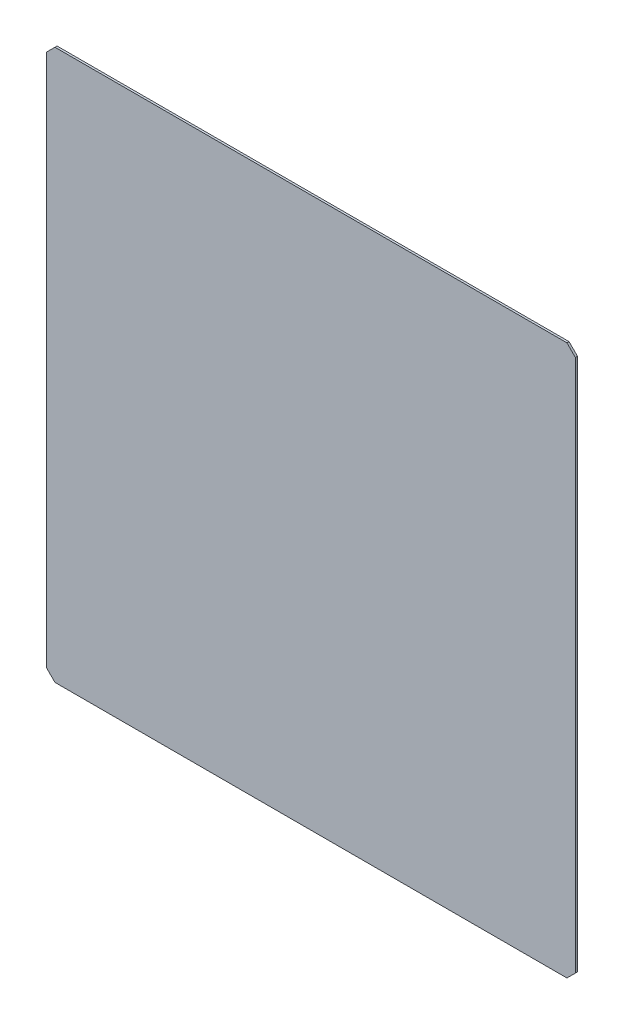
ISO-10303-21;
HEADER;
FILE_DESCRIPTION(('STEP AP214'),'2;1');
FILE_NAME('part.step','',(''),(''),'','','');
FILE_SCHEMA(('AUTOMOTIVE_DESIGN { 1 0 10303 214 1 1 1 1 }'));
ENDSEC;
DATA;
#1=APPLICATION_CONTEXT('core data for automotive mechanical design processes');
#2=APPLICATION_PROTOCOL_DEFINITION('international standard','automotive_design',2000,#1);
#3=PRODUCT_CONTEXT('',#1,'mechanical');
#4=PRODUCT('Part','Part','',(#3));
#5=PRODUCT_RELATED_PRODUCT_CATEGORY('part','',(#4));
#6=PRODUCT_DEFINITION_FORMATION('','',#4);
#7=PRODUCT_DEFINITION_CONTEXT('part definition',#1,'design');
#8=PRODUCT_DEFINITION('design','',#6,#7);
#9=PRODUCT_DEFINITION_SHAPE('','',#8);
#10=(LENGTH_UNIT() NAMED_UNIT(*) SI_UNIT(.MILLI.,.METRE.));
#11=(NAMED_UNIT(*) PLANE_ANGLE_UNIT() SI_UNIT($,.RADIAN.));
#12=(NAMED_UNIT(*) SI_UNIT($,.STERADIAN.) SOLID_ANGLE_UNIT());
#13=UNCERTAINTY_MEASURE_WITH_UNIT(LENGTH_MEASURE(1.E-05),#10,'distance_accuracy_value','');
#14=(GEOMETRIC_REPRESENTATION_CONTEXT(3) GLOBAL_UNCERTAINTY_ASSIGNED_CONTEXT((#13)) GLOBAL_UNIT_ASSIGNED_CONTEXT((#10,
#11,#12)) REPRESENTATION_CONTEXT('',''));
#15=CARTESIAN_POINT('',(0.,0.,0.));
#16=DIRECTION('',(0.,0.,1.));
#17=DIRECTION('',(1.,0.,0.));
#18=AXIS2_PLACEMENT_3D('',#15,#16,#17);
#19=CARTESIAN_POINT('',(-6.25,6.5,0.05));
#20=DIRECTION('',(1.,0.,0.));
#21=DIRECTION('',(0.,0.,-1.));
#22=AXIS2_PLACEMENT_3D('',#19,#20,#21);
#23=PLANE('',#22);
#24=DIRECTION('',(0.,-1.,0.));
#25=VECTOR('',#24,1.);
#26=CARTESIAN_POINT('',(-6.25,6.5,0.05));
#27=LINE('',#26,#25);
#28=CARTESIAN_POINT('',(-6.25,6.3,0.05));
#29=VERTEX_POINT('',#28);
#30=CARTESIAN_POINT('',(-6.25,-6.3,0.05));
#31=VERTEX_POINT('',#30);
#32=EDGE_CURVE('E11',#29,#31,#27,.T.);
#33=ORIENTED_EDGE('',*,*,#32,.F.);
#34=DIRECTION('',(0.,0.,-1.));
#35=VECTOR('',#34,1.);
#36=CARTESIAN_POINT('',(-6.25,6.3,0.05));
#37=LINE('',#36,#35);
#38=CARTESIAN_POINT('',(-6.25,6.3,0.));
#39=VERTEX_POINT('',#38);
#40=EDGE_CURVE('E23',#29,#39,#37,.T.);
#41=ORIENTED_EDGE('',*,*,#40,.T.);
#42=DIRECTION('',(0.,-1.,0.));
#43=VECTOR('',#42,1.);
#44=CARTESIAN_POINT('',(-6.25,6.5,0.));
#45=LINE('',#44,#43);
#46=CARTESIAN_POINT('',(-6.25,-6.3,0.));
#47=VERTEX_POINT('',#46);
#48=EDGE_CURVE('E143',#39,#47,#45,.T.);
#49=ORIENTED_EDGE('',*,*,#48,.T.);
#50=DIRECTION('',(0.,0.,1.));
#51=VECTOR('',#50,1.);
#52=CARTESIAN_POINT('',(-6.25,-6.3,0.05));
#53=LINE('',#52,#51);
#54=EDGE_CURVE('E36',#47,#31,#53,.T.);
#55=ORIENTED_EDGE('',*,*,#54,.T.);
#56=EDGE_LOOP('',(#33,#41,#49,#55));
#57=FACE_BOUND('',#56,.T.);
#58=ADVANCED_FACE('F16',(#57),#23,.F.);
#59=CARTESIAN_POINT('',(-6.05,-6.5,0.05));
#60=DIRECTION('',(0.707106781186548,0.707106781186548,0.));
#61=DIRECTION('',(-0.707106781186548,0.707106781186548,0.));
#62=AXIS2_PLACEMENT_3D('',#59,#60,#61);
#63=PLANE('',#62);
#64=DIRECTION('',(-0.707106781186548,0.707106781186548,0.));
#65=VECTOR('',#64,1.);
#66=CARTESIAN_POINT('',(-6.15,-6.4,0.05));
#67=LINE('',#66,#65);
#68=CARTESIAN_POINT('',(-6.05,-6.5,0.05));
#69=VERTEX_POINT('',#68);
#70=EDGE_CURVE('E88',#69,#31,#67,.T.);
#71=ORIENTED_EDGE('',*,*,#70,.T.);
#72=ORIENTED_EDGE('',*,*,#54,.F.);
#73=DIRECTION('',(0.707106781186548,-0.707106781186548,0.));
#74=VECTOR('',#73,1.);
#75=CARTESIAN_POINT('',(-6.05,-6.5,0.));
#76=LINE('',#75,#74);
#77=CARTESIAN_POINT('',(-6.05,-6.5,0.));
#78=VERTEX_POINT('',#77);
#79=EDGE_CURVE('E138',#47,#78,#76,.T.);
#80=ORIENTED_EDGE('',*,*,#79,.T.);
#81=DIRECTION('',(0.,0.,-1.));
#82=VECTOR('',#81,1.);
#83=CARTESIAN_POINT('',(-6.05,-6.5,0.05));
#84=LINE('',#83,#82);
#85=EDGE_CURVE('E136',#69,#78,#84,.T.);
#86=ORIENTED_EDGE('',*,*,#85,.F.);
#87=EDGE_LOOP('',(#71,#72,#80,#86));
#88=FACE_BOUND('',#87,.T.);
#89=ADVANCED_FACE('F152',(#88),#63,.F.);
#90=CARTESIAN_POINT('',(6.05,6.5,0.05));
#91=DIRECTION('',(-0.707106781186548,-0.707106781186548,0.));
#92=DIRECTION('',(0.707106781186548,-0.707106781186548,0.));
#93=AXIS2_PLACEMENT_3D('',#90,#91,#92);
#94=PLANE('',#93);
#95=DIRECTION('',(0.707106781186548,-0.707106781186548,0.));
#96=VECTOR('',#95,1.);
#97=CARTESIAN_POINT('',(6.4,6.15,0.05));
#98=LINE('',#97,#96);
#99=CARTESIAN_POINT('',(6.05,6.5,0.05));
#100=VERTEX_POINT('',#99);
#101=CARTESIAN_POINT('',(6.25,6.3,0.05));
#102=VERTEX_POINT('',#101);
#103=EDGE_CURVE('E133',#100,#102,#98,.T.);
#104=ORIENTED_EDGE('',*,*,#103,.T.);
#105=DIRECTION('',(0.,0.,1.));
#106=VECTOR('',#105,1.);
#107=CARTESIAN_POINT('',(6.25,6.3,0.05));
#108=LINE('',#107,#106);
#109=CARTESIAN_POINT('',(6.25,6.3,0.));
#110=VERTEX_POINT('',#109);
#111=EDGE_CURVE('E131',#110,#102,#108,.T.);
#112=ORIENTED_EDGE('',*,*,#111,.F.);
#113=DIRECTION('',(-0.707106781186548,0.707106781186548,0.));
#114=VECTOR('',#113,1.);
#115=CARTESIAN_POINT('',(6.05,6.5,0.));
#116=LINE('',#115,#114);
#117=CARTESIAN_POINT('',(6.05,6.5,0.));
#118=VERTEX_POINT('',#117);
#119=EDGE_CURVE('E128',#110,#118,#116,.T.);
#120=ORIENTED_EDGE('',*,*,#119,.T.);
#121=DIRECTION('',(0.,0.,-1.));
#122=VECTOR('',#121,1.);
#123=CARTESIAN_POINT('',(6.05,6.5,0.05));
#124=LINE('',#123,#122);
#125=EDGE_CURVE('E126',#100,#118,#124,.T.);
#126=ORIENTED_EDGE('',*,*,#125,.F.);
#127=EDGE_LOOP('',(#104,#112,#120,#126));
#128=FACE_BOUND('',#127,.T.);
#129=ADVANCED_FACE('F154',(#128),#94,.F.);
#130=CARTESIAN_POINT('',(6.25,6.5,0.05));
#131=DIRECTION('',(0.,-1.,0.));
#132=DIRECTION('',(0.,0.,-1.));
#133=AXIS2_PLACEMENT_3D('',#130,#131,#132);
#134=PLANE('',#133);
#135=DIRECTION('',(-1.,0.,0.));
#136=VECTOR('',#135,1.);
#137=CARTESIAN_POINT('',(6.25,6.5,0.05));
#138=LINE('',#137,#136);
#139=CARTESIAN_POINT('',(-6.05,6.5,0.05));
#140=VERTEX_POINT('',#139);
#141=EDGE_CURVE('E123',#100,#140,#138,.T.);
#142=ORIENTED_EDGE('',*,*,#141,.F.);
#143=ORIENTED_EDGE('',*,*,#125,.T.);
#144=DIRECTION('',(-1.,0.,0.));
#145=VECTOR('',#144,1.);
#146=CARTESIAN_POINT('',(6.25,6.5,0.));
#147=LINE('',#146,#145);
#148=CARTESIAN_POINT('',(-6.05,6.5,0.));
#149=VERTEX_POINT('',#148);
#150=EDGE_CURVE('E120',#118,#149,#147,.T.);
#151=ORIENTED_EDGE('',*,*,#150,.T.);
#152=DIRECTION('',(0.,0.,1.));
#153=VECTOR('',#152,1.);
#154=CARTESIAN_POINT('',(-6.05,6.5,0.05));
#155=LINE('',#154,#153);
#156=EDGE_CURVE('E118',#149,#140,#155,.T.);
#157=ORIENTED_EDGE('',*,*,#156,.T.);
#158=EDGE_LOOP('',(#142,#143,#151,#157));
#159=FACE_BOUND('',#158,.T.);
#160=ADVANCED_FACE('F160',(#159),#134,.F.);
#161=CARTESIAN_POINT('',(-6.25,-6.5,0.));
#162=DIRECTION('',(0.,0.,1.));
#163=DIRECTION('',(1.,0.,0.));
#164=AXIS2_PLACEMENT_3D('',#161,#162,#163);
#165=PLANE('',#164);
#166=ORIENTED_EDGE('',*,*,#150,.F.);
#167=ORIENTED_EDGE('',*,*,#119,.F.);
#168=DIRECTION('',(0.,1.,0.));
#169=VECTOR('',#168,1.);
#170=CARTESIAN_POINT('',(6.25,-6.5,0.));
#171=LINE('',#170,#169);
#172=CARTESIAN_POINT('',(6.25,-6.3,0.));
#173=VERTEX_POINT('',#172);
#174=EDGE_CURVE('E115',#173,#110,#171,.T.);
#175=ORIENTED_EDGE('',*,*,#174,.F.);
#176=DIRECTION('',(0.707106781186548,0.707106781186548,0.));
#177=VECTOR('',#176,1.);
#178=CARTESIAN_POINT('',(6.25,-6.3,0.));
#179=LINE('',#178,#177);
#180=CARTESIAN_POINT('',(6.05,-6.5,0.));
#181=VERTEX_POINT('',#180);
#182=EDGE_CURVE('E113',#181,#173,#179,.T.);
#183=ORIENTED_EDGE('',*,*,#182,.F.);
#184=DIRECTION('',(1.,0.,0.));
#185=VECTOR('',#184,1.);
#186=CARTESIAN_POINT('',(-6.25,-6.5,0.));
#187=LINE('',#186,#185);
#188=EDGE_CURVE('E102',#78,#181,#187,.T.);
#189=ORIENTED_EDGE('',*,*,#188,.F.);
#190=ORIENTED_EDGE('',*,*,#79,.F.);
#191=ORIENTED_EDGE('',*,*,#48,.F.);
#192=DIRECTION('',(-0.707106781186548,-0.707106781186548,0.));
#193=VECTOR('',#192,1.);
#194=CARTESIAN_POINT('',(-6.25,6.3,0.));
#195=LINE('',#194,#193);
#196=EDGE_CURVE('E110',#149,#39,#195,.T.);
#197=ORIENTED_EDGE('',*,*,#196,.F.);
#198=EDGE_LOOP('',(#166,#167,#175,#183,#189,#190,#191,#197));
#199=FACE_BOUND('',#198,.T.);
#200=ADVANCED_FACE('F150',(#199),#165,.F.);
#201=CARTESIAN_POINT('',(-6.25,-6.5,0.05));
#202=DIRECTION('',(0.,0.,1.));
#203=DIRECTION('',(1.,0.,0.));
#204=AXIS2_PLACEMENT_3D('',#201,#202,#203);
#205=PLANE('',#204);
#206=DIRECTION('',(0.,1.,0.));
#207=VECTOR('',#206,1.);
#208=CARTESIAN_POINT('',(6.25,-6.5,0.05));
#209=LINE('',#208,#207);
#210=CARTESIAN_POINT('',(6.25,-6.3,0.05));
#211=VERTEX_POINT('',#210);
#212=EDGE_CURVE('E108',#211,#102,#209,.T.);
#213=ORIENTED_EDGE('',*,*,#212,.T.);
#214=ORIENTED_EDGE('',*,*,#103,.F.);
#215=ORIENTED_EDGE('',*,*,#141,.T.);
#216=DIRECTION('',(0.707106781186548,0.707106781186548,0.));
#217=VECTOR('',#216,1.);
#218=CARTESIAN_POINT('',(-12.65,-0.09999999999997,0.05));
#219=LINE('',#218,#217);
#220=EDGE_CURVE('E91',#29,#140,#219,.T.);
#221=ORIENTED_EDGE('',*,*,#220,.F.);
#222=ORIENTED_EDGE('',*,*,#32,.T.);
#223=ORIENTED_EDGE('',*,*,#70,.F.);
#224=DIRECTION('',(1.,0.,0.));
#225=VECTOR('',#224,1.);
#226=CARTESIAN_POINT('',(-6.25,-6.5,0.05));
#227=LINE('',#226,#225);
#228=CARTESIAN_POINT('',(6.05,-6.5,0.05));
#229=VERTEX_POINT('',#228);
#230=EDGE_CURVE('E81',#69,#229,#227,.T.);
#231=ORIENTED_EDGE('',*,*,#230,.T.);
#232=DIRECTION('',(-0.707106781186548,-0.707106781186548,0.));
#233=VECTOR('',#232,1.);
#234=CARTESIAN_POINT('',(-0.09999999999996,-12.65,0.05));
#235=LINE('',#234,#233);
#236=EDGE_CURVE('E85',#211,#229,#235,.T.);
#237=ORIENTED_EDGE('',*,*,#236,.F.);
#238=EDGE_LOOP('',(#213,#214,#215,#221,#222,#223,#231,#237));
#239=FACE_BOUND('',#238,.T.);
#240=ADVANCED_FACE('F84',(#239),#205,.T.);
#241=CARTESIAN_POINT('',(-6.25,-6.5,0.05));
#242=DIRECTION('',(0.,1.,0.));
#243=DIRECTION('',(0.,0.,1.));
#244=AXIS2_PLACEMENT_3D('',#241,#242,#243);
#245=PLANE('',#244);
#246=ORIENTED_EDGE('',*,*,#188,.T.);
#247=DIRECTION('',(0.,0.,1.));
#248=VECTOR('',#247,1.);
#249=CARTESIAN_POINT('',(6.05,-6.5,0.05));
#250=LINE('',#249,#248);
#251=EDGE_CURVE('E96',#181,#229,#250,.T.);
#252=ORIENTED_EDGE('',*,*,#251,.T.);
#253=ORIENTED_EDGE('',*,*,#230,.F.);
#254=ORIENTED_EDGE('',*,*,#85,.T.);
#255=EDGE_LOOP('',(#246,#252,#253,#254));
#256=FACE_BOUND('',#255,.T.);
#257=ADVANCED_FACE('F100',(#256),#245,.F.);
#258=CARTESIAN_POINT('',(6.25,-6.3,0.05));
#259=DIRECTION('',(-0.707106781186548,0.707106781186548,0.));
#260=DIRECTION('',(-0.707106781186548,-0.707106781186548,0.));
#261=AXIS2_PLACEMENT_3D('',#258,#259,#260);
#262=PLANE('',#261);
#263=ORIENTED_EDGE('',*,*,#236,.T.);
#264=ORIENTED_EDGE('',*,*,#251,.F.);
#265=ORIENTED_EDGE('',*,*,#182,.T.);
#266=DIRECTION('',(0.,0.,-1.));
#267=VECTOR('',#266,1.);
#268=CARTESIAN_POINT('',(6.25,-6.3,0.05));
#269=LINE('',#268,#267);
#270=EDGE_CURVE('E98',#211,#173,#269,.T.);
#271=ORIENTED_EDGE('',*,*,#270,.F.);
#272=EDGE_LOOP('',(#263,#264,#265,#271));
#273=FACE_BOUND('',#272,.T.);
#274=ADVANCED_FACE('F95',(#273),#262,.F.);
#275=CARTESIAN_POINT('',(6.25,-6.5,0.05));
#276=DIRECTION('',(-1.,0.,0.));
#277=DIRECTION('',(0.,0.,1.));
#278=AXIS2_PLACEMENT_3D('',#275,#276,#277);
#279=PLANE('',#278);
#280=ORIENTED_EDGE('',*,*,#174,.T.);
#281=ORIENTED_EDGE('',*,*,#111,.T.);
#282=ORIENTED_EDGE('',*,*,#212,.F.);
#283=ORIENTED_EDGE('',*,*,#270,.T.);
#284=EDGE_LOOP('',(#280,#281,#282,#283));
#285=FACE_BOUND('',#284,.T.);
#286=ADVANCED_FACE('F175',(#285),#279,.F.);
#287=CARTESIAN_POINT('',(-6.25,6.3,0.05));
#288=DIRECTION('',(0.707106781186548,-0.707106781186548,0.));
#289=DIRECTION('',(0.707106781186548,0.707106781186548,0.));
#290=AXIS2_PLACEMENT_3D('',#287,#288,#289);
#291=PLANE('',#290);
#292=ORIENTED_EDGE('',*,*,#220,.T.);
#293=ORIENTED_EDGE('',*,*,#156,.F.);
#294=ORIENTED_EDGE('',*,*,#196,.T.);
#295=ORIENTED_EDGE('',*,*,#40,.F.);
#296=EDGE_LOOP('',(#292,#293,#294,#295));
#297=FACE_BOUND('',#296,.T.);
#298=ADVANCED_FACE('F147',(#297),#291,.F.);
#299=CLOSED_SHELL('',(#58,#89,#129,#160,#200,#240,#257,#274,#286,#298));
#300=MANIFOLD_SOLID_BREP('B1',#299);
#301=ADVANCED_BREP_SHAPE_REPRESENTATION('',(#18,#300),#14);
#302=SHAPE_DEFINITION_REPRESENTATION(#9,#301);
ENDSEC;
END-ISO-10303-21;
